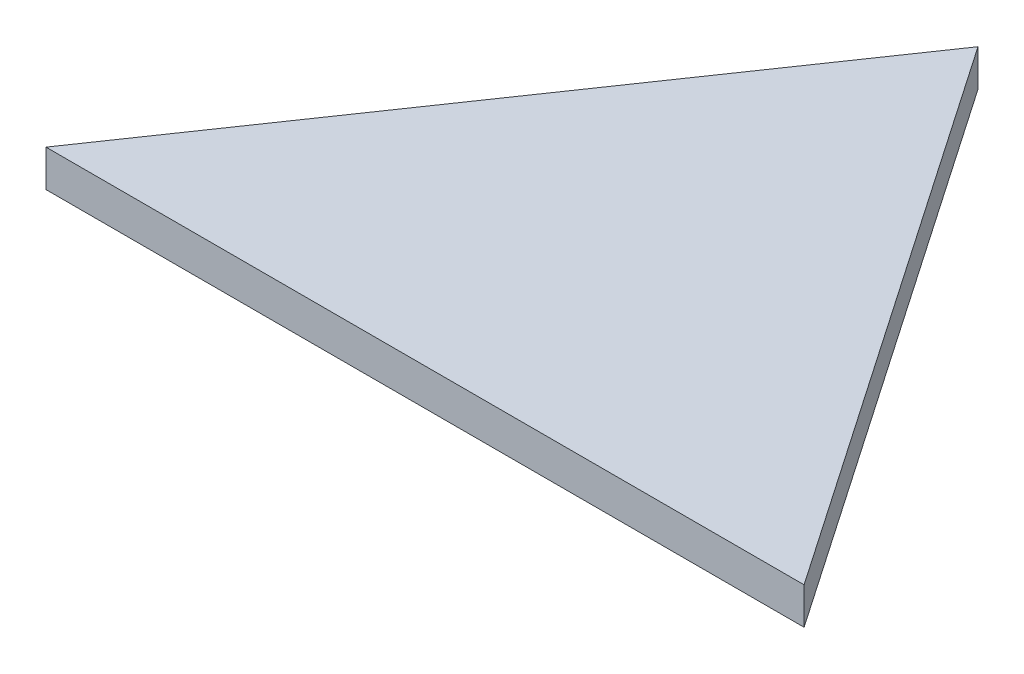
ISO-10303-21;
HEADER;
FILE_DESCRIPTION(('STEP AP214'),'2;1');
FILE_NAME('part.step','',(''),(''),'','','');
FILE_SCHEMA(('AUTOMOTIVE_DESIGN { 1 0 10303 214 1 1 1 1 }'));
ENDSEC;
DATA;
#1=APPLICATION_CONTEXT('core data for automotive mechanical design processes');
#2=APPLICATION_PROTOCOL_DEFINITION('international standard','automotive_design',2000,#1);
#3=PRODUCT_CONTEXT('',#1,'mechanical');
#4=PRODUCT('Part','Part','',(#3));
#5=PRODUCT_RELATED_PRODUCT_CATEGORY('part','',(#4));
#6=PRODUCT_DEFINITION_FORMATION('','',#4);
#7=PRODUCT_DEFINITION_CONTEXT('part definition',#1,'design');
#8=PRODUCT_DEFINITION('design','',#6,#7);
#9=PRODUCT_DEFINITION_SHAPE('','',#8);
#10=(LENGTH_UNIT() NAMED_UNIT(*) SI_UNIT(.MILLI.,.METRE.));
#11=(NAMED_UNIT(*) PLANE_ANGLE_UNIT() SI_UNIT($,.RADIAN.));
#12=(NAMED_UNIT(*) SI_UNIT($,.STERADIAN.) SOLID_ANGLE_UNIT());
#13=UNCERTAINTY_MEASURE_WITH_UNIT(LENGTH_MEASURE(1.E-05),#10,'distance_accuracy_value','');
#14=(GEOMETRIC_REPRESENTATION_CONTEXT(3) GLOBAL_UNCERTAINTY_ASSIGNED_CONTEXT((#13)) GLOBAL_UNIT_ASSIGNED_CONTEXT((#10,
#11,#12)) REPRESENTATION_CONTEXT('',''));
#15=CARTESIAN_POINT('',(0.,0.,0.));
#16=DIRECTION('',(0.,0.,1.));
#17=DIRECTION('',(1.,0.,0.));
#18=AXIS2_PLACEMENT_3D('',#15,#16,#17);
#19=CARTESIAN_POINT('',(927.028125598448,90.,-1352.37088638784));
#20=DIRECTION('',(0.824817569155793,0.,0.56539895437817));
#21=DIRECTION('',(0.56539895437817,0.,-0.824817569155793));
#22=AXIS2_PLACEMENT_3D('',#19,#20,#21);
#23=PLANE('',#22);
#24=DIRECTION('',(-0.56539895437817,0.,0.824817569155793));
#25=VECTOR('',#24,1.);
#26=CARTESIAN_POINT('',(927.028125598448,0.,-1352.37088638784));
#27=LINE('',#26,#25);
#28=CARTESIAN_POINT('',(927.028125598448,0.,-1352.37088638784));
#29=VERTEX_POINT('',#28);
#30=CARTESIAN_POINT('',(0.,0.,0.));
#31=VERTEX_POINT('',#30);
#32=EDGE_CURVE('E79',#29,#31,#27,.T.);
#33=ORIENTED_EDGE('',*,*,#32,.T.);
#34=DIRECTION('',(0.,-1.,0.));
#35=VECTOR('',#34,1.);
#36=CARTESIAN_POINT('',(0.,90.,0.));
#37=LINE('',#36,#35);
#38=CARTESIAN_POINT('',(0.,90.,0.));
#39=VERTEX_POINT('',#38);
#40=EDGE_CURVE('E11',#39,#31,#37,.T.);
#41=ORIENTED_EDGE('',*,*,#40,.F.);
#42=DIRECTION('',(-0.56539895437817,0.,0.824817569155793));
#43=VECTOR('',#42,1.);
#44=CARTESIAN_POINT('',(927.028125598448,90.,-1352.37088638784));
#45=LINE('',#44,#43);
#46=CARTESIAN_POINT('',(927.028125598448,90.,-1352.37088638784));
#47=VERTEX_POINT('',#46);
#48=EDGE_CURVE('E72',#47,#39,#45,.T.);
#49=ORIENTED_EDGE('',*,*,#48,.F.);
#50=DIRECTION('',(0.,-1.,0.));
#51=VECTOR('',#50,1.);
#52=CARTESIAN_POINT('',(927.028125598448,90.,-1352.37088638784));
#53=LINE('',#52,#51);
#54=EDGE_CURVE('E80',#47,#29,#53,.T.);
#55=ORIENTED_EDGE('',*,*,#54,.T.);
#56=EDGE_LOOP('',(#33,#41,#49,#55));
#57=FACE_BOUND('',#56,.T.);
#58=ADVANCED_FACE('F32',(#57),#23,.F.);
#59=CARTESIAN_POINT('',(0.,90.,0.));
#60=DIRECTION('',(0.,0.,-1.));
#61=DIRECTION('',(-1.,0.,0.));
#62=AXIS2_PLACEMENT_3D('',#59,#60,#61);
#63=PLANE('',#62);
#64=DIRECTION('',(1.,0.,0.));
#65=VECTOR('',#64,1.);
#66=CARTESIAN_POINT('',(0.,0.,0.));
#67=LINE('',#66,#65);
#68=CARTESIAN_POINT('',(1854.0562511969,0.,0.));
#69=VERTEX_POINT('',#68);
#70=EDGE_CURVE('E60',#31,#69,#67,.T.);
#71=ORIENTED_EDGE('',*,*,#70,.T.);
#72=DIRECTION('',(0.,-1.,0.));
#73=VECTOR('',#72,1.);
#74=CARTESIAN_POINT('',(1854.0562511969,90.,0.));
#75=LINE('',#74,#73);
#76=CARTESIAN_POINT('',(1854.0562511969,90.,0.));
#77=VERTEX_POINT('',#76);
#78=EDGE_CURVE('E40',#77,#69,#75,.T.);
#79=ORIENTED_EDGE('',*,*,#78,.F.);
#80=DIRECTION('',(1.,0.,0.));
#81=VECTOR('',#80,1.);
#82=CARTESIAN_POINT('',(0.,90.,0.));
#83=LINE('',#82,#81);
#84=EDGE_CURVE('E68',#39,#77,#83,.T.);
#85=ORIENTED_EDGE('',*,*,#84,.F.);
#86=ORIENTED_EDGE('',*,*,#40,.T.);
#87=EDGE_LOOP('',(#71,#79,#85,#86));
#88=FACE_BOUND('',#87,.T.);
#89=ADVANCED_FACE('F69',(#88),#63,.F.);
#90=CARTESIAN_POINT('',(1854.0562511969,90.,0.));
#91=DIRECTION('',(-0.824817569155793,0.,0.56539895437817));
#92=DIRECTION('',(0.56539895437817,0.,0.824817569155794));
#93=AXIS2_PLACEMENT_3D('',#90,#91,#92);
#94=PLANE('',#93);
#95=DIRECTION('',(-0.56539895437817,0.,-0.824817569155794));
#96=VECTOR('',#95,1.);
#97=CARTESIAN_POINT('',(1854.0562511969,0.,0.));
#98=LINE('',#97,#96);
#99=EDGE_CURVE('E65',#69,#29,#98,.T.);
#100=ORIENTED_EDGE('',*,*,#99,.T.);
#101=ORIENTED_EDGE('',*,*,#54,.F.);
#102=DIRECTION('',(-0.56539895437817,0.,-0.824817569155794));
#103=VECTOR('',#102,1.);
#104=CARTESIAN_POINT('',(1854.0562511969,90.,0.));
#105=LINE('',#104,#103);
#106=EDGE_CURVE('E48',#77,#47,#105,.T.);
#107=ORIENTED_EDGE('',*,*,#106,.F.);
#108=ORIENTED_EDGE('',*,*,#78,.T.);
#109=EDGE_LOOP('',(#100,#101,#107,#108));
#110=FACE_BOUND('',#109,.T.);
#111=ADVANCED_FACE('F87',(#110),#94,.F.);
#112=CARTESIAN_POINT('',(0.,90.,0.));
#113=DIRECTION('',(0.,-1.,0.));
#114=DIRECTION('',(0.,0.,-1.));
#115=AXIS2_PLACEMENT_3D('',#112,#113,#114);
#116=PLANE('',#115);
#117=ORIENTED_EDGE('',*,*,#48,.T.);
#118=ORIENTED_EDGE('',*,*,#84,.T.);
#119=ORIENTED_EDGE('',*,*,#106,.T.);
#120=EDGE_LOOP('',(#117,#118,#119));
#121=FACE_BOUND('',#120,.T.);
#122=ADVANCED_FACE('F75',(#121),#116,.F.);
#123=CARTESIAN_POINT('',(0.,0.,0.));
#124=DIRECTION('',(0.,-1.,0.));
#125=DIRECTION('',(0.,0.,-1.));
#126=AXIS2_PLACEMENT_3D('',#123,#124,#125);
#127=PLANE('',#126);
#128=ORIENTED_EDGE('',*,*,#32,.F.);
#129=ORIENTED_EDGE('',*,*,#99,.F.);
#130=ORIENTED_EDGE('',*,*,#70,.F.);
#131=EDGE_LOOP('',(#128,#129,#130));
#132=FACE_BOUND('',#131,.T.);
#133=ADVANCED_FACE('F88',(#132),#127,.T.);
#134=CLOSED_SHELL('',(#58,#89,#111,#122,#133));
#135=MANIFOLD_SOLID_BREP('B2',#134);
#136=ADVANCED_BREP_SHAPE_REPRESENTATION('',(#18,#135),#14);
#137=SHAPE_DEFINITION_REPRESENTATION(#9,#136);
ENDSEC;
END-ISO-10303-21;
